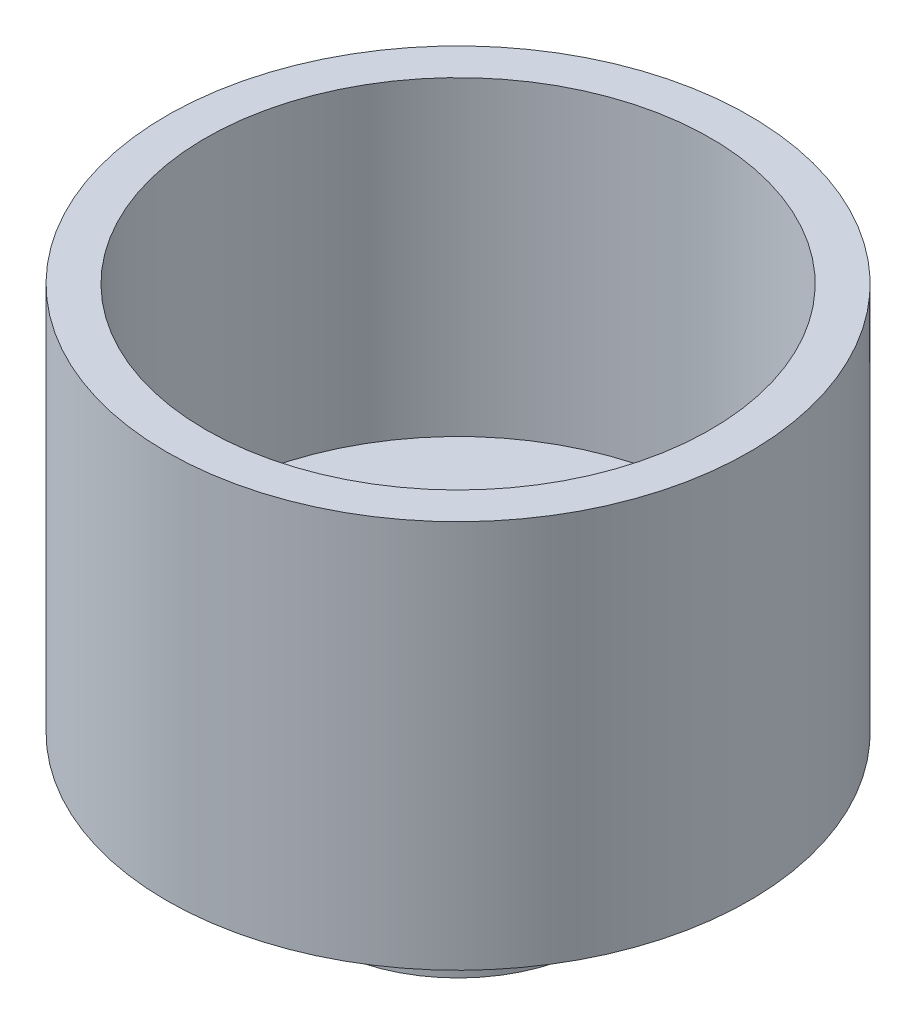
ISO-10303-21;
HEADER;
FILE_DESCRIPTION(('STEP AP214'),'2;1');
FILE_NAME('part.step','',(''),(''),'','','');
FILE_SCHEMA(('AUTOMOTIVE_DESIGN { 1 0 10303 214 1 1 1 1 }'));
ENDSEC;
DATA;
#1=APPLICATION_CONTEXT('core data for automotive mechanical design processes');
#2=APPLICATION_PROTOCOL_DEFINITION('international standard','automotive_design',2000,#1);
#3=PRODUCT_CONTEXT('',#1,'mechanical');
#4=PRODUCT('Part','Part','',(#3));
#5=PRODUCT_RELATED_PRODUCT_CATEGORY('part','',(#4));
#6=PRODUCT_DEFINITION_FORMATION('','',#4);
#7=PRODUCT_DEFINITION_CONTEXT('part definition',#1,'design');
#8=PRODUCT_DEFINITION('design','',#6,#7);
#9=PRODUCT_DEFINITION_SHAPE('','',#8);
#10=(LENGTH_UNIT() NAMED_UNIT(*) SI_UNIT(.MILLI.,.METRE.));
#11=(NAMED_UNIT(*) PLANE_ANGLE_UNIT() SI_UNIT($,.RADIAN.));
#12=(NAMED_UNIT(*) SI_UNIT($,.STERADIAN.) SOLID_ANGLE_UNIT());
#13=UNCERTAINTY_MEASURE_WITH_UNIT(LENGTH_MEASURE(1.E-05),#10,'distance_accuracy_value','');
#14=(GEOMETRIC_REPRESENTATION_CONTEXT(3) GLOBAL_UNCERTAINTY_ASSIGNED_CONTEXT((#13)) GLOBAL_UNIT_ASSIGNED_CONTEXT((#10,
#11,#12)) REPRESENTATION_CONTEXT('',''));
#15=CARTESIAN_POINT('',(0.,0.,0.));
#16=DIRECTION('',(0.,0.,1.));
#17=DIRECTION('',(1.,0.,0.));
#18=AXIS2_PLACEMENT_3D('',#15,#16,#17);
#19=CARTESIAN_POINT('',(0.,50.,0.));
#20=DIRECTION('',(0.,-1.,0.));
#21=DIRECTION('',(0.,0.,-1.));
#22=AXIS2_PLACEMENT_3D('',#19,#20,#21);
#23=CYLINDRICAL_SURFACE('',#22,37.5);
#24=CARTESIAN_POINT('',(0.,50.,0.));
#25=DIRECTION('',(0.,1.,0.));
#26=DIRECTION('',(0.,0.,1.));
#27=AXIS2_PLACEMENT_3D('',#24,#25,#26);
#28=CIRCLE('',#27,37.5);
#29=CARTESIAN_POINT('',(0.,50.,37.5));
#30=VERTEX_POINT('',#29);
#31=EDGE_CURVE('E45',#30,#30,#28,.T.);
#32=ORIENTED_EDGE('',*,*,#31,.F.);
#33=EDGE_LOOP('',(#32));
#34=FACE_BOUND('',#33,.T.);
#35=CARTESIAN_POINT('',(0.,0.,0.));
#36=DIRECTION('',(0.,1.,0.));
#37=DIRECTION('',(0.,0.,1.));
#38=AXIS2_PLACEMENT_3D('',#35,#36,#37);
#39=CIRCLE('',#38,37.5);
#40=CARTESIAN_POINT('',(0.,0.,37.5));
#41=VERTEX_POINT('',#40);
#42=EDGE_CURVE('E51',#41,#41,#39,.T.);
#43=ORIENTED_EDGE('',*,*,#42,.T.);
#44=EDGE_LOOP('',(#43));
#45=FACE_BOUND('',#44,.T.);
#46=ADVANCED_FACE('F37',(#34,#45),#23,.T.);
#47=CARTESIAN_POINT('',(0.,50.,0.));
#48=DIRECTION('',(0.,1.,0.));
#49=DIRECTION('',(0.,0.,1.));
#50=AXIS2_PLACEMENT_3D('',#47,#48,#49);
#51=PLANE('',#50);
#52=CARTESIAN_POINT('',(0.,50.,0.));
#53=DIRECTION('',(0.,1.,0.));
#54=DIRECTION('',(0.,0.,1.));
#55=AXIS2_PLACEMENT_3D('',#52,#53,#54);
#56=CIRCLE('',#55,32.5);
#57=CARTESIAN_POINT('',(0.,50.,32.5));
#58=VERTEX_POINT('',#57);
#59=EDGE_CURVE('E61',#58,#58,#56,.T.);
#60=ORIENTED_EDGE('',*,*,#59,.F.);
#61=EDGE_LOOP('',(#60));
#62=FACE_BOUND('',#61,.T.);
#63=ORIENTED_EDGE('',*,*,#31,.T.);
#64=EDGE_LOOP('',(#63));
#65=FACE_BOUND('',#64,.T.);
#66=ADVANCED_FACE('F112',(#62,#65),#51,.T.);
#67=CARTESIAN_POINT('',(0.,0.,0.));
#68=DIRECTION('',(0.,1.,0.));
#69=DIRECTION('',(0.,0.,1.));
#70=AXIS2_PLACEMENT_3D('',#67,#68,#69);
#71=PLANE('',#70);
#72=CARTESIAN_POINT('',(-27.3527445534784,0.,0.));
#73=DIRECTION('',(0.,-1.,0.));
#74=DIRECTION('',(0.,0.,-1.));
#75=AXIS2_PLACEMENT_3D('',#72,#73,#74);
#76=CIRCLE('',#75,3.25);
#77=CARTESIAN_POINT('',(-27.3527445534784,0.,-3.25));
#78=VERTEX_POINT('',#77);
#79=EDGE_CURVE('E85',#78,#78,#76,.T.);
#80=ORIENTED_EDGE('',*,*,#79,.F.);
#81=EDGE_LOOP('',(#80));
#82=FACE_BOUND('',#81,.T.);
#83=CARTESIAN_POINT('',(25.9782126377069,0.,-0.984986916331978));
#84=DIRECTION('',(0.,-1.,0.));
#85=DIRECTION('',(0.,0.,-1.));
#86=AXIS2_PLACEMENT_3D('',#83,#84,#85);
#87=CIRCLE('',#86,3.5);
#88=CARTESIAN_POINT('',(25.9782126377069,0.,-4.48498691633198));
#89=VERTEX_POINT('',#88);
#90=EDGE_CURVE('E71',#89,#89,#87,.T.);
#91=ORIENTED_EDGE('',*,*,#90,.F.);
#92=EDGE_LOOP('',(#91));
#93=FACE_BOUND('',#92,.T.);
#94=CARTESIAN_POINT('',(0.,0.,0.));
#95=DIRECTION('',(0.,-1.,0.));
#96=DIRECTION('',(0.,0.,-1.));
#97=AXIS2_PLACEMENT_3D('',#94,#95,#96);
#98=CIRCLE('',#97,17.5);
#99=CARTESIAN_POINT('',(0.,0.,-17.5));
#100=VERTEX_POINT('',#99);
#101=EDGE_CURVE('E10',#100,#100,#98,.T.);
#102=ORIENTED_EDGE('',*,*,#101,.F.);
#103=EDGE_LOOP('',(#102));
#104=FACE_BOUND('',#103,.T.);
#105=ORIENTED_EDGE('',*,*,#42,.F.);
#106=EDGE_LOOP('',(#105));
#107=FACE_BOUND('',#106,.T.);
#108=ADVANCED_FACE('F117',(#82,#93,#104,#107),#71,.F.);
#109=CARTESIAN_POINT('',(0.,10.,0.));
#110=DIRECTION('',(0.,1.,0.));
#111=DIRECTION('',(0.,0.,1.));
#112=AXIS2_PLACEMENT_3D('',#109,#110,#111);
#113=CYLINDRICAL_SURFACE('',#112,32.5);
#114=CARTESIAN_POINT('',(0.,10.,0.));
#115=DIRECTION('',(0.,1.,0.));
#116=DIRECTION('',(0.,0.,1.));
#117=AXIS2_PLACEMENT_3D('',#114,#115,#116);
#118=CIRCLE('',#117,32.5);
#119=CARTESIAN_POINT('',(0.,10.,32.5));
#120=VERTEX_POINT('',#119);
#121=EDGE_CURVE('E57',#120,#120,#118,.T.);
#122=ORIENTED_EDGE('',*,*,#121,.F.);
#123=EDGE_LOOP('',(#122));
#124=FACE_BOUND('',#123,.T.);
#125=ORIENTED_EDGE('',*,*,#59,.T.);
#126=EDGE_LOOP('',(#125));
#127=FACE_BOUND('',#126,.T.);
#128=ADVANCED_FACE('F108',(#124,#127),#113,.F.);
#129=CARTESIAN_POINT('',(0.,10.,0.));
#130=DIRECTION('',(0.,1.,0.));
#131=DIRECTION('',(0.,0.,1.));
#132=AXIS2_PLACEMENT_3D('',#129,#130,#131);
#133=PLANE('',#132);
#134=CARTESIAN_POINT('',(-27.3527445534784,10.,0.));
#135=DIRECTION('',(0.,1.,0.));
#136=DIRECTION('',(0.,0.,1.));
#137=AXIS2_PLACEMENT_3D('',#134,#135,#136);
#138=CIRCLE('',#137,3.25);
#139=CARTESIAN_POINT('',(-27.3527445534784,10.,3.25));
#140=VERTEX_POINT('',#139);
#141=EDGE_CURVE('E40',#140,#140,#138,.T.);
#142=ORIENTED_EDGE('',*,*,#141,.F.);
#143=EDGE_LOOP('',(#142));
#144=FACE_BOUND('',#143,.T.);
#145=CARTESIAN_POINT('',(25.9782126377069,10.,-0.984986916331978));
#146=DIRECTION('',(0.,1.,0.));
#147=DIRECTION('',(0.,0.,1.));
#148=AXIS2_PLACEMENT_3D('',#145,#146,#147);
#149=CIRCLE('',#148,3.5);
#150=CARTESIAN_POINT('',(25.9782126377069,10.,2.51501308366802));
#151=VERTEX_POINT('',#150);
#152=EDGE_CURVE('E67',#151,#151,#149,.T.);
#153=ORIENTED_EDGE('',*,*,#152,.F.);
#154=EDGE_LOOP('',(#153));
#155=FACE_BOUND('',#154,.T.);
#156=CARTESIAN_POINT('',(0.,10.,0.));
#157=DIRECTION('',(0.,1.,0.));
#158=DIRECTION('',(0.,0.,1.));
#159=AXIS2_PLACEMENT_3D('',#156,#157,#158);
#160=CIRCLE('',#159,14.5);
#161=CARTESIAN_POINT('',(0.,10.,14.5));
#162=VERTEX_POINT('',#161);
#163=EDGE_CURVE('E77',#162,#162,#160,.T.);
#164=ORIENTED_EDGE('',*,*,#163,.F.);
#165=EDGE_LOOP('',(#164));
#166=FACE_BOUND('',#165,.T.);
#167=ORIENTED_EDGE('',*,*,#121,.T.);
#168=EDGE_LOOP('',(#167));
#169=FACE_BOUND('',#168,.T.);
#170=ADVANCED_FACE('F99',(#144,#155,#166,#169),#133,.T.);
#171=CARTESIAN_POINT('',(0.,-15.,0.));
#172=DIRECTION('',(0.,1.,0.));
#173=DIRECTION('',(0.,0.,1.));
#174=AXIS2_PLACEMENT_3D('',#171,#172,#173);
#175=CYLINDRICAL_SURFACE('',#174,17.5);
#176=CARTESIAN_POINT('',(0.,-15.,0.));
#177=DIRECTION('',(0.,-1.,0.));
#178=DIRECTION('',(0.,0.,-1.));
#179=AXIS2_PLACEMENT_3D('',#176,#177,#178);
#180=CIRCLE('',#179,17.5);
#181=CARTESIAN_POINT('',(0.,-15.,-17.5));
#182=VERTEX_POINT('',#181);
#183=EDGE_CURVE('E55',#182,#182,#180,.T.);
#184=ORIENTED_EDGE('',*,*,#183,.F.);
#185=EDGE_LOOP('',(#184));
#186=FACE_BOUND('',#185,.T.);
#187=ORIENTED_EDGE('',*,*,#101,.T.);
#188=EDGE_LOOP('',(#187));
#189=FACE_BOUND('',#188,.T.);
#190=ADVANCED_FACE('F97',(#186,#189),#175,.T.);
#191=CARTESIAN_POINT('',(0.,-15.,0.));
#192=DIRECTION('',(0.,-1.,0.));
#193=DIRECTION('',(0.,0.,-1.));
#194=AXIS2_PLACEMENT_3D('',#191,#192,#193);
#195=PLANE('',#194);
#196=CARTESIAN_POINT('',(0.,-15.,0.));
#197=DIRECTION('',(0.,-1.,0.));
#198=DIRECTION('',(0.,0.,-1.));
#199=AXIS2_PLACEMENT_3D('',#196,#197,#198);
#200=CIRCLE('',#199,14.5);
#201=CARTESIAN_POINT('',(0.,-15.,-14.5));
#202=VERTEX_POINT('',#201);
#203=EDGE_CURVE('E70',#202,#202,#200,.T.);
#204=ORIENTED_EDGE('',*,*,#203,.F.);
#205=EDGE_LOOP('',(#204));
#206=FACE_BOUND('',#205,.T.);
#207=ORIENTED_EDGE('',*,*,#183,.T.);
#208=EDGE_LOOP('',(#207));
#209=FACE_BOUND('',#208,.T.);
#210=ADVANCED_FACE('F95',(#206,#209),#195,.T.);
#211=CARTESIAN_POINT('',(0.,50.,0.));
#212=DIRECTION('',(0.,-1.,0.));
#213=DIRECTION('',(0.,0.,-1.));
#214=AXIS2_PLACEMENT_3D('',#211,#212,#213);
#215=CYLINDRICAL_SURFACE('',#214,14.5);
#216=ORIENTED_EDGE('',*,*,#163,.T.);
#217=EDGE_LOOP('',(#216));
#218=FACE_BOUND('',#217,.T.);
#219=ORIENTED_EDGE('',*,*,#203,.T.);
#220=EDGE_LOOP('',(#219));
#221=FACE_BOUND('',#220,.T.);
#222=ADVANCED_FACE('F105',(#218,#221),#215,.F.);
#223=CARTESIAN_POINT('',(25.9782126377069,50.,-0.984986916331978));
#224=DIRECTION('',(0.,-1.,0.));
#225=DIRECTION('',(0.,0.,-1.));
#226=AXIS2_PLACEMENT_3D('',#223,#224,#225);
#227=CYLINDRICAL_SURFACE('',#226,3.5);
#228=ORIENTED_EDGE('',*,*,#152,.T.);
#229=EDGE_LOOP('',(#228));
#230=FACE_BOUND('',#229,.T.);
#231=ORIENTED_EDGE('',*,*,#90,.T.);
#232=EDGE_LOOP('',(#231));
#233=FACE_BOUND('',#232,.T.);
#234=ADVANCED_FACE('F139',(#230,#233),#227,.F.);
#235=CARTESIAN_POINT('',(-27.3527445534784,50.,0.));
#236=DIRECTION('',(0.,-1.,0.));
#237=DIRECTION('',(0.,0.,-1.));
#238=AXIS2_PLACEMENT_3D('',#235,#236,#237);
#239=CYLINDRICAL_SURFACE('',#238,3.25);
#240=ORIENTED_EDGE('',*,*,#141,.T.);
#241=EDGE_LOOP('',(#240));
#242=FACE_BOUND('',#241,.T.);
#243=ORIENTED_EDGE('',*,*,#79,.T.);
#244=EDGE_LOOP('',(#243));
#245=FACE_BOUND('',#244,.T.);
#246=ADVANCED_FACE('F137',(#242,#245),#239,.F.);
#247=CLOSED_SHELL('',(#46,#66,#108,#128,#170,#190,#210,#222,#234,#246));
#248=MANIFOLD_SOLID_BREP('B2',#247);
#249=ADVANCED_BREP_SHAPE_REPRESENTATION('',(#18,#248),#14);
#250=SHAPE_DEFINITION_REPRESENTATION(#9,#249);
ENDSEC;
END-ISO-10303-21;
